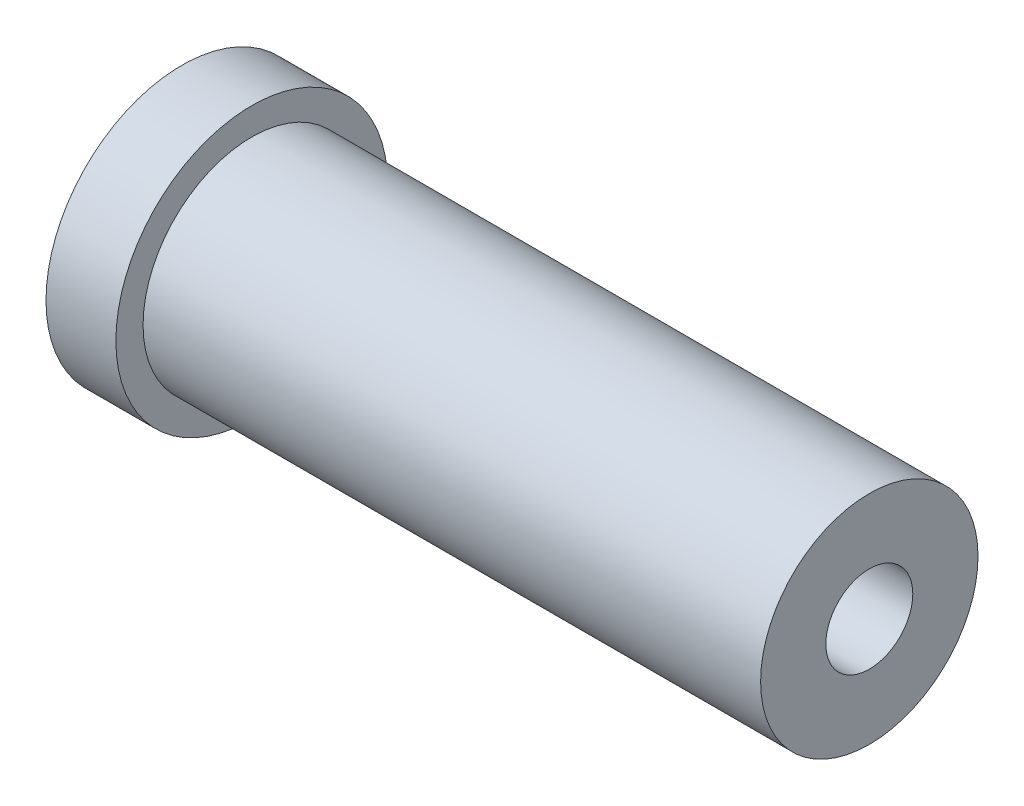
ISO-10303-21;
HEADER;
FILE_DESCRIPTION(('STEP AP214'),'2;1');
FILE_NAME('part.step','',(''),(''),'','','');
FILE_SCHEMA(('AUTOMOTIVE_DESIGN { 1 0 10303 214 1 1 1 1 }'));
ENDSEC;
DATA;
#1=APPLICATION_CONTEXT('core data for automotive mechanical design processes');
#2=APPLICATION_PROTOCOL_DEFINITION('international standard','automotive_design',2000,#1);
#3=PRODUCT_CONTEXT('',#1,'mechanical');
#4=PRODUCT('Part','Part','',(#3));
#5=PRODUCT_RELATED_PRODUCT_CATEGORY('part','',(#4));
#6=PRODUCT_DEFINITION_FORMATION('','',#4);
#7=PRODUCT_DEFINITION_CONTEXT('part definition',#1,'design');
#8=PRODUCT_DEFINITION('design','',#6,#7);
#9=PRODUCT_DEFINITION_SHAPE('','',#8);
#10=(LENGTH_UNIT() NAMED_UNIT(*) SI_UNIT(.MILLI.,.METRE.));
#11=(NAMED_UNIT(*) PLANE_ANGLE_UNIT() SI_UNIT($,.RADIAN.));
#12=(NAMED_UNIT(*) SI_UNIT($,.STERADIAN.) SOLID_ANGLE_UNIT());
#13=UNCERTAINTY_MEASURE_WITH_UNIT(LENGTH_MEASURE(1.E-05),#10,'distance_accuracy_value','');
#14=(GEOMETRIC_REPRESENTATION_CONTEXT(3) GLOBAL_UNCERTAINTY_ASSIGNED_CONTEXT((#13)) GLOBAL_UNIT_ASSIGNED_CONTEXT((#10,
#11,#12)) REPRESENTATION_CONTEXT('',''));
#15=CARTESIAN_POINT('',(0.,0.,0.));
#16=DIRECTION('',(0.,0.,1.));
#17=DIRECTION('',(1.,0.,0.));
#18=AXIS2_PLACEMENT_3D('',#15,#16,#17);
#19=CARTESIAN_POINT('',(63.25,0.,0.));
#20=DIRECTION('',(-1.,0.,0.));
#21=DIRECTION('',(0.,0.,1.));
#22=AXIS2_PLACEMENT_3D('',#19,#20,#21);
#23=CYLINDRICAL_SURFACE('',#22,10.);
#24=CARTESIAN_POINT('',(63.25,0.,0.));
#25=DIRECTION('',(1.,0.,0.));
#26=DIRECTION('',(0.,0.,-1.));
#27=AXIS2_PLACEMENT_3D('',#24,#25,#26);
#28=CIRCLE('',#27,10.);
#29=CARTESIAN_POINT('',(63.25,0.,-10.));
#30=VERTEX_POINT('',#29);
#31=EDGE_CURVE('E37',#30,#30,#28,.T.);
#32=ORIENTED_EDGE('',*,*,#31,.F.);
#33=EDGE_LOOP('',(#32));
#34=FACE_BOUND('',#33,.T.);
#35=CARTESIAN_POINT('',(6.43,0.,0.));
#36=DIRECTION('',(-1.,0.,0.));
#37=DIRECTION('',(0.,0.,1.));
#38=AXIS2_PLACEMENT_3D('',#35,#36,#37);
#39=CIRCLE('',#38,10.);
#40=CARTESIAN_POINT('',(6.43,0.,10.));
#41=VERTEX_POINT('',#40);
#42=EDGE_CURVE('E10',#41,#41,#39,.T.);
#43=ORIENTED_EDGE('',*,*,#42,.F.);
#44=EDGE_LOOP('',(#43));
#45=FACE_BOUND('',#44,.T.);
#46=ADVANCED_FACE('F31',(#34,#45),#23,.T.);
#47=CARTESIAN_POINT('',(63.25,0.,0.));
#48=DIRECTION('',(1.,0.,0.));
#49=DIRECTION('',(0.,0.,-1.));
#50=AXIS2_PLACEMENT_3D('',#47,#48,#49);
#51=PLANE('',#50);
#52=CARTESIAN_POINT('',(63.25,0.,0.));
#53=DIRECTION('',(1.,0.,0.));
#54=DIRECTION('',(0.,0.,-1.));
#55=AXIS2_PLACEMENT_3D('',#52,#53,#54);
#56=CIRCLE('',#55,4.);
#57=CARTESIAN_POINT('',(63.25,0.,-4.));
#58=VERTEX_POINT('',#57);
#59=EDGE_CURVE('E51',#58,#58,#56,.T.);
#60=ORIENTED_EDGE('',*,*,#59,.F.);
#61=EDGE_LOOP('',(#60));
#62=FACE_BOUND('',#61,.T.);
#63=ORIENTED_EDGE('',*,*,#31,.T.);
#64=EDGE_LOOP('',(#63));
#65=FACE_BOUND('',#64,.T.);
#66=ADVANCED_FACE('F66',(#62,#65),#51,.T.);
#67=CARTESIAN_POINT('',(6.43,0.,0.));
#68=DIRECTION('',(-1.,0.,0.));
#69=DIRECTION('',(0.,0.,1.));
#70=AXIS2_PLACEMENT_3D('',#67,#68,#69);
#71=CYLINDRICAL_SURFACE('',#70,12.5);
#72=CARTESIAN_POINT('',(6.43,0.,0.));
#73=DIRECTION('',(-1.,0.,0.));
#74=DIRECTION('',(0.,0.,1.));
#75=AXIS2_PLACEMENT_3D('',#72,#73,#74);
#76=CIRCLE('',#75,12.5);
#77=CARTESIAN_POINT('',(6.43,0.,12.5));
#78=VERTEX_POINT('',#77);
#79=EDGE_CURVE('E41',#78,#78,#76,.T.);
#80=CARTESIAN_POINT('',(0.,0.,0.));
#81=DIRECTION('',(-1.,0.,0.));
#82=DIRECTION('',(0.,0.,1.));
#83=AXIS2_PLACEMENT_3D('',#80,#81,#82);
#84=CIRCLE('',#83,12.5);
#85=CARTESIAN_POINT('',(0.,0.,12.5));
#86=VERTEX_POINT('',#85);
#87=EDGE_CURVE('E45',#86,#86,#84,.T.);
#88=CARTESIAN_POINT('',(6.43,0.,12.5));
#89=CARTESIAN_POINT('',(6.36302083333333,0.,12.5));
#90=CARTESIAN_POINT('',(6.29604166666667,0.,12.5));
#91=CARTESIAN_POINT('',(6.16208333333333,0.,12.5));
#92=CARTESIAN_POINT('',(6.09510416666667,0.,12.5));
#93=CARTESIAN_POINT('',(5.96114583333333,0.,12.5));
#94=CARTESIAN_POINT('',(5.89416666666667,0.,12.5));
#95=CARTESIAN_POINT('',(5.76020833333333,0.,12.5));
#96=CARTESIAN_POINT('',(5.69322916666667,0.,12.5));
#97=CARTESIAN_POINT('',(5.55927083333333,0.,12.5));
#98=CARTESIAN_POINT('',(5.49229166666667,0.,12.5));
#99=CARTESIAN_POINT('',(5.35833333333333,0.,12.5));
#100=CARTESIAN_POINT('',(5.29135416666667,0.,12.5));
#101=CARTESIAN_POINT('',(5.15739583333333,0.,12.5));
#102=CARTESIAN_POINT('',(5.09041666666667,0.,12.5));
#103=CARTESIAN_POINT('',(4.95645833333333,0.,12.5));
#104=CARTESIAN_POINT('',(4.88947916666667,0.,12.5));
#105=CARTESIAN_POINT('',(4.75552083333333,0.,12.5));
#106=CARTESIAN_POINT('',(4.68854166666667,0.,12.5));
#107=CARTESIAN_POINT('',(4.55458333333333,0.,12.5));
#108=CARTESIAN_POINT('',(4.48760416666667,0.,12.5));
#109=CARTESIAN_POINT('',(4.35364583333333,0.,12.5));
#110=CARTESIAN_POINT('',(4.28666666666667,0.,12.5));
#111=CARTESIAN_POINT('',(4.15270833333333,0.,12.5));
#112=CARTESIAN_POINT('',(4.08572916666667,0.,12.5));
#113=CARTESIAN_POINT('',(3.95177083333333,0.,12.5));
#114=CARTESIAN_POINT('',(3.88479166666667,0.,12.5));
#115=CARTESIAN_POINT('',(3.75083333333333,0.,12.5));
#116=CARTESIAN_POINT('',(3.68385416666667,0.,12.5));
#117=CARTESIAN_POINT('',(3.54989583333333,0.,12.5));
#118=CARTESIAN_POINT('',(3.48291666666667,0.,12.5));
#119=CARTESIAN_POINT('',(3.34895833333333,0.,12.5));
#120=CARTESIAN_POINT('',(3.28197916666667,0.,12.5));
#121=CARTESIAN_POINT('',(3.14802083333333,0.,12.5));
#122=CARTESIAN_POINT('',(3.08104166666667,0.,12.5));
#123=CARTESIAN_POINT('',(2.94708333333333,0.,12.5));
#124=CARTESIAN_POINT('',(2.88010416666667,0.,12.5));
#125=CARTESIAN_POINT('',(2.74614583333333,0.,12.5));
#126=CARTESIAN_POINT('',(2.67916666666667,0.,12.5));
#127=CARTESIAN_POINT('',(2.54520833333333,0.,12.5));
#128=CARTESIAN_POINT('',(2.47822916666667,0.,12.5));
#129=CARTESIAN_POINT('',(2.34427083333333,0.,12.5));
#130=CARTESIAN_POINT('',(2.27729166666667,0.,12.5));
#131=CARTESIAN_POINT('',(2.14333333333333,0.,12.5));
#132=CARTESIAN_POINT('',(2.07635416666667,0.,12.5));
#133=CARTESIAN_POINT('',(1.94239583333333,0.,12.5));
#134=CARTESIAN_POINT('',(1.87541666666667,0.,12.5));
#135=CARTESIAN_POINT('',(1.74145833333333,0.,12.5));
#136=CARTESIAN_POINT('',(1.67447916666667,0.,12.5));
#137=CARTESIAN_POINT('',(1.54052083333333,0.,12.5));
#138=CARTESIAN_POINT('',(1.47354166666667,0.,12.5));
#139=CARTESIAN_POINT('',(1.33958333333333,0.,12.5));
#140=CARTESIAN_POINT('',(1.27260416666667,0.,12.5));
#141=CARTESIAN_POINT('',(1.13864583333333,0.,12.5));
#142=CARTESIAN_POINT('',(1.07166666666667,0.,12.5));
#143=CARTESIAN_POINT('',(0.937708333333334,0.,12.5));
#144=CARTESIAN_POINT('',(0.870729166666668,0.,12.5));
#145=CARTESIAN_POINT('',(0.736770833333334,0.,12.5));
#146=CARTESIAN_POINT('',(0.669791666666667,0.,12.5));
#147=CARTESIAN_POINT('',(0.535833333333334,0.,12.5));
#148=CARTESIAN_POINT('',(0.468854166666668,0.,12.5));
#149=CARTESIAN_POINT('',(0.334895833333334,0.,12.5));
#150=CARTESIAN_POINT('',(0.267916666666667,0.,12.5));
#151=CARTESIAN_POINT('',(0.133958333333334,0.,12.5));
#152=CARTESIAN_POINT('',(0.0669791666666674,0.,12.5));
#153=CARTESIAN_POINT('',(0.,0.,12.5));
#154=B_SPLINE_CURVE_WITH_KNOTS('',3,(#88,#89,#90,#91,#92,#93,#94,#95,#96,#97,#98,#99,#100,#101,
#102,#103,#104,#105,#106,#107,#108,#109,#110,#111,#112,#113,#114,#115,#116,#117,#118,#119,#120,
#121,#122,#123,#124,#125,#126,#127,#128,#129,#130,#131,#132,#133,#134,#135,#136,#137,#138,#139,
#140,#141,#142,#143,#144,#145,#146,#147,#148,#149,#150,#151,#152,#153),.UNSPECIFIED.,.F.,.F.,(4,
2,2,2,2,2,2,2,2,2,2,2,2,2,2,2,2,2,2,2,2,2,2,2,2,2,2,2,2,2,2,2,4),(0.,0.2009375,
0.401874999999999,0.602812499999999,0.80375,1.0046875,1.205625,1.4065625,1.6075,1.8084375,
2.009375,2.2103125,2.41125,2.6121875,2.813125,3.0140625,3.215,3.4159375,3.616875,3.8178125,
4.01875,4.2196875,4.420625,4.6215625,4.8225,5.0234375,5.224375,5.4253125,5.62625,5.8271875,
6.028125,6.2290625,6.43),.UNSPECIFIED.);
#155=EDGE_CURVE('BSEAM68',#78,#86,#154,.T.);
#156=ORIENTED_EDGE('',*,*,#79,.T.);
#157=ORIENTED_EDGE('',*,*,#87,.F.);
#158=ORIENTED_EDGE('',*,*,#155,.T.);
#159=ORIENTED_EDGE('',*,*,#155,.F.);
#160=EDGE_LOOP('',(#156,#158,#157,#159));
#161=FACE_BOUND('',#160,.T.);
#162=ADVANCED_FACE('F68',(#161),#71,.T.);
#163=CARTESIAN_POINT('',(6.43,0.,0.));
#164=DIRECTION('',(-1.,0.,0.));
#165=DIRECTION('',(0.,0.,1.));
#166=AXIS2_PLACEMENT_3D('',#163,#164,#165);
#167=PLANE('',#166);
#168=ORIENTED_EDGE('',*,*,#42,.T.);
#169=EDGE_LOOP('',(#168));
#170=FACE_BOUND('',#169,.T.);
#171=ORIENTED_EDGE('',*,*,#79,.F.);
#172=EDGE_LOOP('',(#171));
#173=FACE_BOUND('',#172,.T.);
#174=ADVANCED_FACE('F74',(#170,#173),#167,.F.);
#175=CARTESIAN_POINT('',(0.,0.,0.));
#176=DIRECTION('',(1.,0.,0.));
#177=DIRECTION('',(0.,0.,-1.));
#178=AXIS2_PLACEMENT_3D('',#175,#176,#177);
#179=PLANE('',#178);
#180=CARTESIAN_POINT('',(0.,0.,0.));
#181=DIRECTION('',(1.,0.,0.));
#182=DIRECTION('',(0.,0.,-1.));
#183=AXIS2_PLACEMENT_3D('',#180,#181,#182);
#184=CIRCLE('',#183,4.);
#185=CARTESIAN_POINT('',(0.,0.,-4.));
#186=VERTEX_POINT('',#185);
#187=EDGE_CURVE('E49',#186,#186,#184,.T.);
#188=ORIENTED_EDGE('',*,*,#187,.T.);
#189=EDGE_LOOP('',(#188));
#190=FACE_BOUND('',#189,.T.);
#191=ORIENTED_EDGE('',*,*,#87,.T.);
#192=EDGE_LOOP('',(#191));
#193=FACE_BOUND('',#192,.T.);
#194=ADVANCED_FACE('F57',(#190,#193),#179,.F.);
#195=CARTESIAN_POINT('',(0.,0.,0.));
#196=DIRECTION('',(1.,0.,0.));
#197=DIRECTION('',(0.,0.,-1.));
#198=AXIS2_PLACEMENT_3D('',#195,#196,#197);
#199=CYLINDRICAL_SURFACE('',#198,4.);
#200=ORIENTED_EDGE('',*,*,#187,.F.);
#201=EDGE_LOOP('',(#200));
#202=FACE_BOUND('',#201,.T.);
#203=ORIENTED_EDGE('',*,*,#59,.T.);
#204=EDGE_LOOP('',(#203));
#205=FACE_BOUND('',#204,.T.);
#206=ADVANCED_FACE('F60',(#202,#205),#199,.F.);
#207=CLOSED_SHELL('',(#46,#66,#162,#174,#194,#206));
#208=MANIFOLD_SOLID_BREP('B2',#207);
#209=ADVANCED_BREP_SHAPE_REPRESENTATION('',(#18,#208),#14);
#210=SHAPE_DEFINITION_REPRESENTATION(#9,#209);
ENDSEC;
END-ISO-10303-21;
